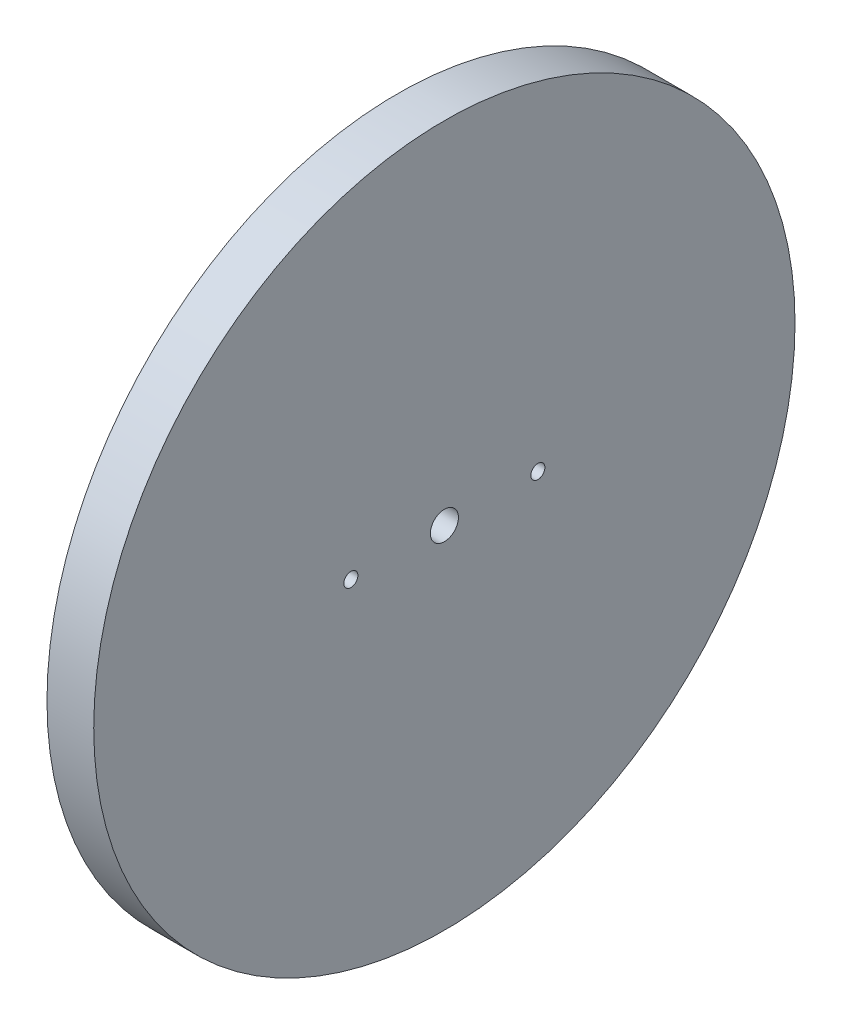
ISO-10303-21;
HEADER;
FILE_DESCRIPTION(('STEP AP214'),'2;1');
FILE_NAME('part.step','',(''),(''),'','','');
FILE_SCHEMA(('AUTOMOTIVE_DESIGN { 1 0 10303 214 1 1 1 1 }'));
ENDSEC;
DATA;
#1=APPLICATION_CONTEXT('core data for automotive mechanical design processes');
#2=APPLICATION_PROTOCOL_DEFINITION('international standard','automotive_design',2000,#1);
#3=PRODUCT_CONTEXT('',#1,'mechanical');
#4=PRODUCT('Part','Part','',(#3));
#5=PRODUCT_RELATED_PRODUCT_CATEGORY('part','',(#4));
#6=PRODUCT_DEFINITION_FORMATION('','',#4);
#7=PRODUCT_DEFINITION_CONTEXT('part definition',#1,'design');
#8=PRODUCT_DEFINITION('design','',#6,#7);
#9=PRODUCT_DEFINITION_SHAPE('','',#8);
#10=(LENGTH_UNIT() NAMED_UNIT(*) SI_UNIT(.MILLI.,.METRE.));
#11=(NAMED_UNIT(*) PLANE_ANGLE_UNIT() SI_UNIT($,.RADIAN.));
#12=(NAMED_UNIT(*) SI_UNIT($,.STERADIAN.) SOLID_ANGLE_UNIT());
#13=UNCERTAINTY_MEASURE_WITH_UNIT(LENGTH_MEASURE(1.E-05),#10,'distance_accuracy_value','');
#14=(GEOMETRIC_REPRESENTATION_CONTEXT(3) GLOBAL_UNCERTAINTY_ASSIGNED_CONTEXT((#13)) GLOBAL_UNIT_ASSIGNED_CONTEXT((#10,
#11,#12)) REPRESENTATION_CONTEXT('',''));
#15=CARTESIAN_POINT('',(0.,0.,0.));
#16=DIRECTION('',(0.,0.,1.));
#17=DIRECTION('',(1.,0.,0.));
#18=AXIS2_PLACEMENT_3D('',#15,#16,#17);
#19=CARTESIAN_POINT('',(0.,0.,-20.));
#20=DIRECTION('',(1.,0.,0.));
#21=DIRECTION('',(0.,0.,-1.));
#22=AXIS2_PLACEMENT_3D('',#19,#20,#21);
#23=CYLINDRICAL_SURFACE('',#22,1.5);
#24=CARTESIAN_POINT('',(10.,0.,-20.));
#25=DIRECTION('',(1.,0.,0.));
#26=DIRECTION('',(0.,0.,-1.));
#27=AXIS2_PLACEMENT_3D('',#24,#25,#26);
#28=CIRCLE('',#27,1.5);
#29=CARTESIAN_POINT('',(10.,0.,-21.5));
#30=VERTEX_POINT('',#29);
#31=EDGE_CURVE('E55',#30,#30,#28,.T.);
#32=ORIENTED_EDGE('',*,*,#31,.T.);
#33=EDGE_LOOP('',(#32));
#34=FACE_BOUND('',#33,.T.);
#35=CARTESIAN_POINT('',(3.,0.,-20.));
#36=DIRECTION('',(-1.,0.,0.));
#37=DIRECTION('',(0.,0.,1.));
#38=AXIS2_PLACEMENT_3D('',#35,#36,#37);
#39=CIRCLE('',#38,1.5);
#40=CARTESIAN_POINT('',(3.,0.,-18.5));
#41=VERTEX_POINT('',#40);
#42=EDGE_CURVE('E39',#41,#41,#39,.F.);
#43=ORIENTED_EDGE('',*,*,#42,.F.);
#44=EDGE_LOOP('',(#43));
#45=FACE_BOUND('',#44,.T.);
#46=ADVANCED_FACE('F35',(#34,#45),#23,.F.);
#47=CARTESIAN_POINT('',(0.,0.,20.));
#48=DIRECTION('',(1.,0.,0.));
#49=DIRECTION('',(0.,0.,-1.));
#50=AXIS2_PLACEMENT_3D('',#47,#48,#49);
#51=CYLINDRICAL_SURFACE('',#50,1.5);
#52=CARTESIAN_POINT('',(10.,0.,20.));
#53=DIRECTION('',(1.,0.,0.));
#54=DIRECTION('',(0.,0.,-1.));
#55=AXIS2_PLACEMENT_3D('',#52,#53,#54);
#56=CIRCLE('',#55,1.5);
#57=CARTESIAN_POINT('',(10.,0.,18.5));
#58=VERTEX_POINT('',#57);
#59=EDGE_CURVE('E78',#58,#58,#56,.T.);
#60=ORIENTED_EDGE('',*,*,#59,.T.);
#61=EDGE_LOOP('',(#60));
#62=FACE_BOUND('',#61,.T.);
#63=CARTESIAN_POINT('',(3.,0.,20.));
#64=DIRECTION('',(-1.,0.,0.));
#65=DIRECTION('',(0.,0.,1.));
#66=AXIS2_PLACEMENT_3D('',#63,#64,#65);
#67=CIRCLE('',#66,1.5);
#68=CARTESIAN_POINT('',(3.,0.,21.5));
#69=VERTEX_POINT('',#68);
#70=EDGE_CURVE('E57',#69,#69,#67,.F.);
#71=ORIENTED_EDGE('',*,*,#70,.F.);
#72=EDGE_LOOP('',(#71));
#73=FACE_BOUND('',#72,.T.);
#74=ADVANCED_FACE('F97',(#62,#73),#51,.F.);
#75=CARTESIAN_POINT('',(0.,0.,0.));
#76=DIRECTION('',(1.,0.,0.));
#77=DIRECTION('',(0.,0.,-1.));
#78=AXIS2_PLACEMENT_3D('',#75,#76,#77);
#79=CYLINDRICAL_SURFACE('',#78,3.);
#80=CARTESIAN_POINT('',(10.,0.,0.));
#81=DIRECTION('',(1.,0.,0.));
#82=DIRECTION('',(0.,0.,-1.));
#83=AXIS2_PLACEMENT_3D('',#80,#81,#82);
#84=CIRCLE('',#83,3.);
#85=CARTESIAN_POINT('',(10.,0.,-3.));
#86=VERTEX_POINT('',#85);
#87=EDGE_CURVE('E48',#86,#86,#84,.T.);
#88=ORIENTED_EDGE('',*,*,#87,.T.);
#89=EDGE_LOOP('',(#88));
#90=FACE_BOUND('',#89,.T.);
#91=CARTESIAN_POINT('',(3.,0.,0.));
#92=DIRECTION('',(-1.,0.,0.));
#93=DIRECTION('',(0.,0.,1.));
#94=AXIS2_PLACEMENT_3D('',#91,#92,#93);
#95=CIRCLE('',#94,3.);
#96=CARTESIAN_POINT('',(3.,0.,3.));
#97=VERTEX_POINT('',#96);
#98=EDGE_CURVE('E53',#97,#97,#95,.F.);
#99=ORIENTED_EDGE('',*,*,#98,.F.);
#100=EDGE_LOOP('',(#99));
#101=FACE_BOUND('',#100,.T.);
#102=ADVANCED_FACE('F94',(#90,#101),#79,.F.);
#103=CARTESIAN_POINT('',(10.,0.,0.));
#104=DIRECTION('',(-1.,0.,0.));
#105=DIRECTION('',(0.,0.,1.));
#106=AXIS2_PLACEMENT_3D('',#103,#104,#105);
#107=CYLINDRICAL_SURFACE('',#106,75.);
#108=CARTESIAN_POINT('',(10.,0.,0.));
#109=DIRECTION('',(1.,0.,0.));
#110=DIRECTION('',(0.,0.,-1.));
#111=AXIS2_PLACEMENT_3D('',#108,#109,#110);
#112=CIRCLE('',#111,75.);
#113=CARTESIAN_POINT('',(10.,0.,-75.));
#114=VERTEX_POINT('',#113);
#115=EDGE_CURVE('E10',#114,#114,#112,.T.);
#116=ORIENTED_EDGE('',*,*,#115,.F.);
#117=EDGE_LOOP('',(#116));
#118=FACE_BOUND('',#117,.T.);
#119=CARTESIAN_POINT('',(0.,0.,0.));
#120=DIRECTION('',(1.,0.,0.));
#121=DIRECTION('',(0.,0.,-1.));
#122=AXIS2_PLACEMENT_3D('',#119,#120,#121);
#123=CIRCLE('',#122,75.);
#124=CARTESIAN_POINT('',(0.,0.,-75.));
#125=VERTEX_POINT('',#124);
#126=EDGE_CURVE('E43',#125,#125,#123,.T.);
#127=ORIENTED_EDGE('',*,*,#126,.T.);
#128=EDGE_LOOP('',(#127));
#129=FACE_BOUND('',#128,.T.);
#130=ADVANCED_FACE('F37',(#118,#129),#107,.T.);
#131=CARTESIAN_POINT('',(10.,0.,0.));
#132=DIRECTION('',(1.,0.,0.));
#133=DIRECTION('',(0.,0.,-1.));
#134=AXIS2_PLACEMENT_3D('',#131,#132,#133);
#135=PLANE('',#134);
#136=ORIENTED_EDGE('',*,*,#59,.F.);
#137=EDGE_LOOP('',(#136));
#138=FACE_BOUND('',#137,.T.);
#139=ORIENTED_EDGE('',*,*,#31,.F.);
#140=EDGE_LOOP('',(#139));
#141=FACE_BOUND('',#140,.T.);
#142=ORIENTED_EDGE('',*,*,#87,.F.);
#143=EDGE_LOOP('',(#142));
#144=FACE_BOUND('',#143,.T.);
#145=ORIENTED_EDGE('',*,*,#115,.T.);
#146=EDGE_LOOP('',(#145));
#147=FACE_BOUND('',#146,.T.);
#148=ADVANCED_FACE('F85',(#138,#141,#144,#147),#135,.T.);
#149=CARTESIAN_POINT('',(0.,0.,0.));
#150=DIRECTION('',(1.,0.,0.));
#151=DIRECTION('',(0.,0.,-1.));
#152=AXIS2_PLACEMENT_3D('',#149,#150,#151);
#153=PLANE('',#152);
#154=CARTESIAN_POINT('',(0.,0.,-20.));
#155=DIRECTION('',(-1.,0.,0.));
#156=DIRECTION('',(0.,0.,1.));
#157=AXIS2_PLACEMENT_3D('',#154,#155,#156);
#158=CIRCLE('',#157,3.);
#159=CARTESIAN_POINT('',(0.,0.,-17.));
#160=VERTEX_POINT('',#159);
#161=EDGE_CURVE('E73',#160,#160,#158,.T.);
#162=ORIENTED_EDGE('',*,*,#161,.F.);
#163=EDGE_LOOP('',(#162));
#164=FACE_BOUND('',#163,.T.);
#165=CARTESIAN_POINT('',(0.,0.,20.));
#166=DIRECTION('',(-1.,0.,0.));
#167=DIRECTION('',(0.,0.,1.));
#168=AXIS2_PLACEMENT_3D('',#165,#166,#167);
#169=CIRCLE('',#168,3.);
#170=CARTESIAN_POINT('',(0.,0.,23.));
#171=VERTEX_POINT('',#170);
#172=EDGE_CURVE('E66',#171,#171,#169,.T.);
#173=ORIENTED_EDGE('',*,*,#172,.F.);
#174=EDGE_LOOP('',(#173));
#175=FACE_BOUND('',#174,.T.);
#176=CARTESIAN_POINT('',(0.,0.,0.));
#177=DIRECTION('',(-1.,0.,0.));
#178=DIRECTION('',(0.,0.,1.));
#179=AXIS2_PLACEMENT_3D('',#176,#177,#178);
#180=CIRCLE('',#179,6.);
#181=CARTESIAN_POINT('',(0.,0.,6.));
#182=VERTEX_POINT('',#181);
#183=EDGE_CURVE('E59',#182,#182,#180,.T.);
#184=ORIENTED_EDGE('',*,*,#183,.F.);
#185=EDGE_LOOP('',(#184));
#186=FACE_BOUND('',#185,.T.);
#187=ORIENTED_EDGE('',*,*,#126,.F.);
#188=EDGE_LOOP('',(#187));
#189=FACE_BOUND('',#188,.T.);
#190=ADVANCED_FACE('F88',(#164,#175,#186,#189),#153,.F.);
#191=CARTESIAN_POINT('',(3.,0.,0.));
#192=DIRECTION('',(-1.,0.,0.));
#193=DIRECTION('',(0.,0.,1.));
#194=AXIS2_PLACEMENT_3D('',#191,#192,#193);
#195=PLANE('',#194);
#196=CARTESIAN_POINT('',(3.,0.,0.));
#197=DIRECTION('',(-1.,0.,0.));
#198=DIRECTION('',(0.,0.,1.));
#199=AXIS2_PLACEMENT_3D('',#196,#197,#198);
#200=CIRCLE('',#199,6.);
#201=CARTESIAN_POINT('',(3.,0.,6.));
#202=VERTEX_POINT('',#201);
#203=EDGE_CURVE('E56',#202,#202,#200,.T.);
#204=ORIENTED_EDGE('',*,*,#203,.T.);
#205=EDGE_LOOP('',(#204));
#206=FACE_BOUND('',#205,.T.);
#207=ORIENTED_EDGE('',*,*,#98,.T.);
#208=EDGE_LOOP('',(#207));
#209=FACE_BOUND('',#208,.T.);
#210=ADVANCED_FACE('F101',(#206,#209),#195,.T.);
#211=CARTESIAN_POINT('',(3.,0.,0.));
#212=DIRECTION('',(-1.,0.,0.));
#213=DIRECTION('',(0.,0.,1.));
#214=AXIS2_PLACEMENT_3D('',#211,#212,#213);
#215=CYLINDRICAL_SURFACE('',#214,6.);
#216=ORIENTED_EDGE('',*,*,#203,.F.);
#217=EDGE_LOOP('',(#216));
#218=FACE_BOUND('',#217,.T.);
#219=ORIENTED_EDGE('',*,*,#183,.T.);
#220=EDGE_LOOP('',(#219));
#221=FACE_BOUND('',#220,.T.);
#222=ADVANCED_FACE('F103',(#218,#221),#215,.F.);
#223=CARTESIAN_POINT('',(3.,0.,20.));
#224=DIRECTION('',(-1.,0.,0.));
#225=DIRECTION('',(0.,0.,1.));
#226=AXIS2_PLACEMENT_3D('',#223,#224,#225);
#227=PLANE('',#226);
#228=CARTESIAN_POINT('',(3.,0.,20.));
#229=DIRECTION('',(-1.,0.,0.));
#230=DIRECTION('',(0.,0.,1.));
#231=AXIS2_PLACEMENT_3D('',#228,#229,#230);
#232=CIRCLE('',#231,3.);
#233=CARTESIAN_POINT('',(3.,0.,23.));
#234=VERTEX_POINT('',#233);
#235=EDGE_CURVE('E60',#234,#234,#232,.T.);
#236=ORIENTED_EDGE('',*,*,#235,.T.);
#237=EDGE_LOOP('',(#236));
#238=FACE_BOUND('',#237,.T.);
#239=ORIENTED_EDGE('',*,*,#70,.T.);
#240=EDGE_LOOP('',(#239));
#241=FACE_BOUND('',#240,.T.);
#242=ADVANCED_FACE('F110',(#238,#241),#227,.T.);
#243=CARTESIAN_POINT('',(3.,0.,20.));
#244=DIRECTION('',(-1.,0.,0.));
#245=DIRECTION('',(0.,0.,1.));
#246=AXIS2_PLACEMENT_3D('',#243,#244,#245);
#247=CYLINDRICAL_SURFACE('',#246,3.);
#248=ORIENTED_EDGE('',*,*,#235,.F.);
#249=EDGE_LOOP('',(#248));
#250=FACE_BOUND('',#249,.T.);
#251=ORIENTED_EDGE('',*,*,#172,.T.);
#252=EDGE_LOOP('',(#251));
#253=FACE_BOUND('',#252,.T.);
#254=ADVANCED_FACE('F160',(#250,#253),#247,.F.);
#255=CARTESIAN_POINT('',(3.,0.,-20.));
#256=DIRECTION('',(-1.,0.,0.));
#257=DIRECTION('',(0.,0.,1.));
#258=AXIS2_PLACEMENT_3D('',#255,#256,#257);
#259=PLANE('',#258);
#260=CARTESIAN_POINT('',(3.,0.,-20.));
#261=DIRECTION('',(-1.,0.,0.));
#262=DIRECTION('',(0.,0.,1.));
#263=AXIS2_PLACEMENT_3D('',#260,#261,#262);
#264=CIRCLE('',#263,3.);
#265=CARTESIAN_POINT('',(3.,0.,-17.));
#266=VERTEX_POINT('',#265);
#267=EDGE_CURVE('E215',#266,#266,#264,.T.);
#268=ORIENTED_EDGE('',*,*,#267,.T.);
#269=EDGE_LOOP('',(#268));
#270=FACE_BOUND('',#269,.T.);
#271=ORIENTED_EDGE('',*,*,#42,.T.);
#272=EDGE_LOOP('',(#271));
#273=FACE_BOUND('',#272,.T.);
#274=ADVANCED_FACE('F154',(#270,#273),#259,.T.);
#275=CARTESIAN_POINT('',(3.,0.,-20.));
#276=DIRECTION('',(-1.,0.,0.));
#277=DIRECTION('',(0.,0.,1.));
#278=AXIS2_PLACEMENT_3D('',#275,#276,#277);
#279=CYLINDRICAL_SURFACE('',#278,3.);
#280=ORIENTED_EDGE('',*,*,#267,.F.);
#281=EDGE_LOOP('',(#280));
#282=FACE_BOUND('',#281,.T.);
#283=ORIENTED_EDGE('',*,*,#161,.T.);
#284=EDGE_LOOP('',(#283));
#285=FACE_BOUND('',#284,.T.);
#286=ADVANCED_FACE('F159',(#282,#285),#279,.F.);
#287=CLOSED_SHELL('',(#46,#74,#102,#130,#148,#190,#210,#222,#242,#254,#274,#286));
#288=MANIFOLD_SOLID_BREP('B2',#287);
#289=ADVANCED_BREP_SHAPE_REPRESENTATION('',(#18,#288),#14);
#290=SHAPE_DEFINITION_REPRESENTATION(#9,#289);
ENDSEC;
END-ISO-10303-21;
